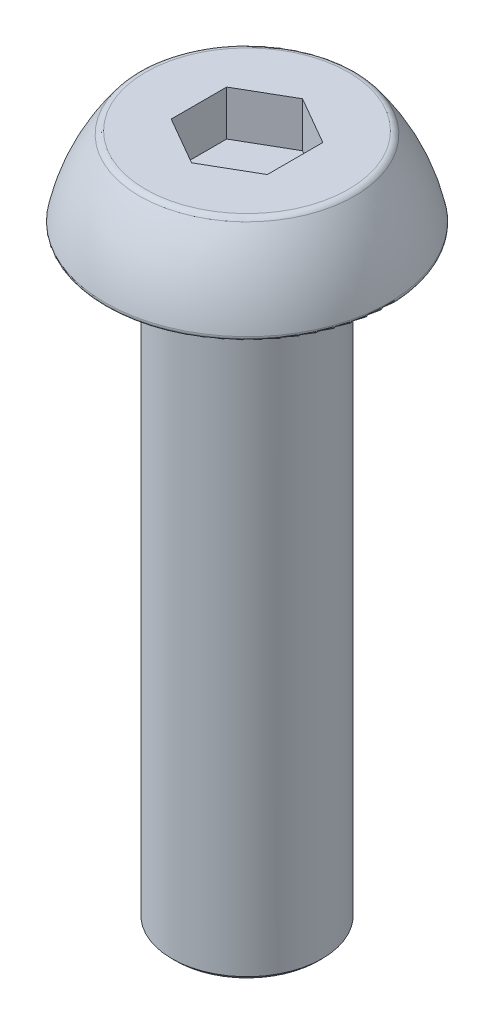
ISO-10303-21;
HEADER;
FILE_DESCRIPTION(('STEP AP214'),'2;1');
FILE_NAME('part.step','',(''),(''),'','','');
FILE_SCHEMA(('AUTOMOTIVE_DESIGN { 1 0 10303 214 1 1 1 1 }'));
ENDSEC;
DATA;
#1=APPLICATION_CONTEXT('core data for automotive mechanical design processes');
#2=APPLICATION_PROTOCOL_DEFINITION('international standard','automotive_design',2000,#1);
#3=PRODUCT_CONTEXT('',#1,'mechanical');
#4=PRODUCT('Part','Part','',(#3));
#5=PRODUCT_RELATED_PRODUCT_CATEGORY('part','',(#4));
#6=PRODUCT_DEFINITION_FORMATION('','',#4);
#7=PRODUCT_DEFINITION_CONTEXT('part definition',#1,'design');
#8=PRODUCT_DEFINITION('design','',#6,#7);
#9=PRODUCT_DEFINITION_SHAPE('','',#8);
#10=(LENGTH_UNIT() NAMED_UNIT(*) SI_UNIT(.MILLI.,.METRE.));
#11=(NAMED_UNIT(*) PLANE_ANGLE_UNIT() SI_UNIT($,.RADIAN.));
#12=(NAMED_UNIT(*) SI_UNIT($,.STERADIAN.) SOLID_ANGLE_UNIT());
#13=UNCERTAINTY_MEASURE_WITH_UNIT(LENGTH_MEASURE(1.E-05),#10,'distance_accuracy_value','');
#14=(GEOMETRIC_REPRESENTATION_CONTEXT(3) GLOBAL_UNCERTAINTY_ASSIGNED_CONTEXT((#13)) GLOBAL_UNIT_ASSIGNED_CONTEXT((#10,
#11,#12)) REPRESENTATION_CONTEXT('',''));
#15=CARTESIAN_POINT('',(0.,0.,0.));
#16=DIRECTION('',(0.,0.,1.));
#17=DIRECTION('',(1.,0.,0.));
#18=AXIS2_PLACEMENT_3D('',#15,#16,#17);
#19=CARTESIAN_POINT('',(0.,0.,0.));
#20=DIRECTION('',(0.,1.,0.));
#21=DIRECTION('',(0.,0.,1.));
#22=AXIS2_PLACEMENT_3D('',#19,#20,#21);
#23=PLANE('',#22);
#24=CARTESIAN_POINT('',(0.,0.,0.));
#25=DIRECTION('',(0.,1.,0.));
#26=DIRECTION('',(0.,0.,1.));
#27=AXIS2_PLACEMENT_3D('',#24,#25,#26);
#28=CIRCLE('',#27,3.67834475098621);
#29=CARTESIAN_POINT('',(0.,0.,3.67834475098621));
#30=VERTEX_POINT('',#29);
#31=EDGE_CURVE('E118',#30,#30,#28,.F.);
#32=ORIENTED_EDGE('',*,*,#31,.T.);
#33=EDGE_LOOP('',(#32));
#34=FACE_BOUND('',#33,.T.);
#35=CARTESIAN_POINT('',(0.,0.,0.));
#36=DIRECTION('',(0.,1.,0.));
#37=DIRECTION('',(0.,0.,1.));
#38=AXIS2_PLACEMENT_3D('',#35,#36,#37);
#39=CIRCLE('',#38,2.);
#40=CARTESIAN_POINT('',(0.,0.,2.));
#41=VERTEX_POINT('',#40);
#42=EDGE_CURVE('E137',#41,#41,#39,.F.);
#43=ORIENTED_EDGE('',*,*,#42,.F.);
#44=EDGE_LOOP('',(#43));
#45=FACE_BOUND('',#44,.T.);
#46=ADVANCED_FACE('F17',(#34,#45),#23,.F.);
#47=CARTESIAN_POINT('',(-2.8,2.2,0.));
#48=DIRECTION('',(0.,-1.,0.));
#49=DIRECTION('',(0.,0.,-1.));
#50=AXIS2_PLACEMENT_3D('',#47,#48,#49);
#51=PLANE('',#50);
#52=DIRECTION('',(-0.866025403784441,0.,0.5));
#53=VECTOR('',#52,1.);
#54=CARTESIAN_POINT('',(0.,2.2,-1.47801668912542));
#55=LINE('',#54,#53);
#56=CARTESIAN_POINT('',(0.,2.2,-1.47801668912542));
#57=VERTEX_POINT('',#56);
#58=CARTESIAN_POINT('',(-1.27999999999998,2.2,-0.739008344562711));
#59=VERTEX_POINT('',#58);
#60=EDGE_CURVE('E106',#57,#59,#55,.T.);
#61=ORIENTED_EDGE('',*,*,#60,.F.);
#62=DIRECTION('',(-0.866025403784441,0.,-0.5));
#63=VECTOR('',#62,1.);
#64=CARTESIAN_POINT('',(1.28,2.2,-0.739008344562722));
#65=LINE('',#64,#63);
#66=CARTESIAN_POINT('',(1.28,2.2,-0.739008344562722));
#67=VERTEX_POINT('',#66);
#68=EDGE_CURVE('E32',#67,#57,#65,.T.);
#69=ORIENTED_EDGE('',*,*,#68,.F.);
#70=DIRECTION('',(0.,0.,-1.));
#71=VECTOR('',#70,1.);
#72=CARTESIAN_POINT('',(1.28,2.2,0.739008344562721));
#73=LINE('',#72,#71);
#74=CARTESIAN_POINT('',(1.28,2.2,0.739008344562721));
#75=VERTEX_POINT('',#74);
#76=EDGE_CURVE('E113',#75,#67,#73,.T.);
#77=ORIENTED_EDGE('',*,*,#76,.F.);
#78=DIRECTION('',(0.866025403784439,0.,-0.5));
#79=VECTOR('',#78,1.);
#80=CARTESIAN_POINT('',(0.,2.2,1.47801668912544));
#81=LINE('',#80,#79);
#82=CARTESIAN_POINT('',(0.,2.2,1.47801668912544));
#83=VERTEX_POINT('',#82);
#84=EDGE_CURVE('E114',#83,#75,#81,.T.);
#85=ORIENTED_EDGE('',*,*,#84,.F.);
#86=DIRECTION('',(0.866025403784439,0.,0.5));
#87=VECTOR('',#86,1.);
#88=CARTESIAN_POINT('',(-1.28,2.2,0.739008344562721));
#89=LINE('',#88,#87);
#90=CARTESIAN_POINT('',(-1.28,2.2,0.739008344562721));
#91=VERTEX_POINT('',#90);
#92=EDGE_CURVE('E79',#91,#83,#89,.T.);
#93=ORIENTED_EDGE('',*,*,#92,.F.);
#94=DIRECTION('',(0.,0.,1.));
#95=VECTOR('',#94,1.);
#96=CARTESIAN_POINT('',(-1.27999999999998,2.2,-0.739008344562711));
#97=LINE('',#96,#95);
#98=EDGE_CURVE('E108',#59,#91,#97,.T.);
#99=ORIENTED_EDGE('',*,*,#98,.F.);
#100=EDGE_LOOP('',(#61,#69,#77,#85,#93,#99));
#101=FACE_BOUND('',#100,.T.);
#102=CARTESIAN_POINT('',(0.,2.2,0.));
#103=DIRECTION('',(0.,-1.,0.));
#104=DIRECTION('',(0.,0.,-1.));
#105=AXIS2_PLACEMENT_3D('',#102,#103,#104);
#106=CIRCLE('',#105,2.70215560417085);
#107=CARTESIAN_POINT('',(0.,2.2,-2.70215560417085));
#108=VERTEX_POINT('',#107);
#109=EDGE_CURVE('E132',#108,#108,#106,.F.);
#110=ORIENTED_EDGE('',*,*,#109,.T.);
#111=EDGE_LOOP('',(#110));
#112=FACE_BOUND('',#111,.T.);
#113=ADVANCED_FACE('F152',(#101,#112),#51,.F.);
#114=CARTESIAN_POINT('',(0.,-0.90769069276326,0.));
#115=DIRECTION('',(0.,-1.,0.));
#116=DIRECTION('',(0.,0.,-1.));
#117=AXIS2_PLACEMENT_3D('',#114,#115,#116);
#118=DEGENERATE_TOROIDAL_SURFACE('',#117,1.11691952407917,5.,.F.);
#119=CARTESIAN_POINT('',(0.,2.12115377886514,0.));
#120=DIRECTION('',(0.,-1.,0.));
#121=DIRECTION('',(0.,0.,-1.));
#122=AXIS2_PLACEMENT_3D('',#119,#120,#121);
#123=CIRCLE('',#122,2.8612837345146);
#124=CARTESIAN_POINT('',(0.,2.12115377886514,-2.8612837345146));
#125=VERTEX_POINT('',#124);
#126=EDGE_CURVE('E129',#125,#125,#123,.T.);
#127=ORIENTED_EDGE('',*,*,#126,.T.);
#128=EDGE_LOOP('',(#127));
#129=FACE_BOUND('',#128,.T.);
#130=CARTESIAN_POINT('',(0.,0.120565116178842,0.));
#131=DIRECTION('',(0.,-1.,0.));
#132=DIRECTION('',(0.,0.,-1.));
#133=AXIS2_PLACEMENT_3D('',#130,#131,#132);
#134=CIRCLE('',#133,3.77620728721203);
#135=CARTESIAN_POINT('',(0.,0.120565116178842,-3.77620728721203));
#136=VERTEX_POINT('',#135);
#137=EDGE_CURVE('E126',#136,#136,#134,.F.);
#138=ORIENTED_EDGE('',*,*,#137,.T.);
#139=EDGE_LOOP('',(#138));
#140=FACE_BOUND('',#139,.T.);
#141=ADVANCED_FACE('F161',(#129,#140),#118,.F.);
#142=CARTESIAN_POINT('',(0.,0.1,0.));
#143=DIRECTION('',(0.,1.,0.));
#144=DIRECTION('',(0.,0.,1.));
#145=AXIS2_PLACEMENT_3D('',#142,#143,#144);
#146=TOROIDAL_SURFACE('',#145,3.67834475098621,0.1);
#147=ORIENTED_EDGE('',*,*,#137,.F.);
#148=EDGE_LOOP('',(#147));
#149=FACE_BOUND('',#148,.T.);
#150=ORIENTED_EDGE('',*,*,#31,.F.);
#151=EDGE_LOOP('',(#150));
#152=FACE_BOUND('',#151,.T.);
#153=ADVANCED_FACE('F168',(#149,#152),#146,.T.);
#154=CARTESIAN_POINT('',(0.,2.,0.));
#155=DIRECTION('',(0.,-1.,0.));
#156=DIRECTION('',(0.,0.,-1.));
#157=AXIS2_PLACEMENT_3D('',#154,#155,#156);
#158=TOROIDAL_SURFACE('',#157,2.70215560417085,0.2);
#159=ORIENTED_EDGE('',*,*,#109,.F.);
#160=EDGE_LOOP('',(#159));
#161=FACE_BOUND('',#160,.T.);
#162=ORIENTED_EDGE('',*,*,#126,.F.);
#163=EDGE_LOOP('',(#162));
#164=FACE_BOUND('',#163,.T.);
#165=ADVANCED_FACE('F173',(#161,#164),#158,.T.);
#166=CARTESIAN_POINT('',(1.28,1.,-0.739008344562722));
#167=DIRECTION('',(0.5,0.,-0.866025403784441));
#168=DIRECTION('',(-0.866025403784441,0.,-0.5));
#169=AXIS2_PLACEMENT_3D('',#166,#167,#168);
#170=PLANE('',#169);
#171=ORIENTED_EDGE('',*,*,#68,.T.);
#172=DIRECTION('',(0.,1.,0.));
#173=VECTOR('',#172,1.);
#174=CARTESIAN_POINT('',(0.,1.,-1.47801668912542));
#175=LINE('',#174,#173);
#176=CARTESIAN_POINT('',(0.,1.,-1.47801668912542));
#177=VERTEX_POINT('',#176);
#178=EDGE_CURVE('E62',#177,#57,#175,.T.);
#179=ORIENTED_EDGE('',*,*,#178,.F.);
#180=DIRECTION('',(-0.866025403784441,0.,-0.5));
#181=VECTOR('',#180,1.);
#182=CARTESIAN_POINT('',(1.28,1.,-0.739008344562722));
#183=LINE('',#182,#181);
#184=CARTESIAN_POINT('',(1.28,1.,-0.739008344562722));
#185=VERTEX_POINT('',#184);
#186=EDGE_CURVE('E117',#185,#177,#183,.T.);
#187=ORIENTED_EDGE('',*,*,#186,.F.);
#188=DIRECTION('',(0.,1.,0.));
#189=VECTOR('',#188,1.);
#190=CARTESIAN_POINT('',(1.28,1.,-0.739008344562722));
#191=LINE('',#190,#189);
#192=EDGE_CURVE('E37',#185,#67,#191,.T.);
#193=ORIENTED_EDGE('',*,*,#192,.T.);
#194=EDGE_LOOP('',(#171,#179,#187,#193));
#195=FACE_BOUND('',#194,.T.);
#196=ADVANCED_FACE('F170',(#195),#170,.F.);
#197=CARTESIAN_POINT('',(1.28,1.,0.739008344562721));
#198=DIRECTION('',(1.,0.,0.));
#199=DIRECTION('',(0.,0.,-1.));
#200=AXIS2_PLACEMENT_3D('',#197,#198,#199);
#201=PLANE('',#200);
#202=ORIENTED_EDGE('',*,*,#76,.T.);
#203=ORIENTED_EDGE('',*,*,#192,.F.);
#204=DIRECTION('',(0.,0.,-1.));
#205=VECTOR('',#204,1.);
#206=CARTESIAN_POINT('',(1.28,1.,0.739008344562721));
#207=LINE('',#206,#205);
#208=CARTESIAN_POINT('',(1.28,1.,0.739008344562721));
#209=VERTEX_POINT('',#208);
#210=EDGE_CURVE('E95',#209,#185,#207,.T.);
#211=ORIENTED_EDGE('',*,*,#210,.F.);
#212=DIRECTION('',(0.,1.,0.));
#213=VECTOR('',#212,1.);
#214=CARTESIAN_POINT('',(1.28,1.,0.739008344562721));
#215=LINE('',#214,#213);
#216=EDGE_CURVE('E81',#209,#75,#215,.T.);
#217=ORIENTED_EDGE('',*,*,#216,.T.);
#218=EDGE_LOOP('',(#202,#203,#211,#217));
#219=FACE_BOUND('',#218,.T.);
#220=ADVANCED_FACE('F181',(#219),#201,.F.);
#221=CARTESIAN_POINT('',(0.,1.,1.47801668912544));
#222=DIRECTION('',(0.5,0.,0.866025403784439));
#223=DIRECTION('',(0.866025403784439,0.,-0.5));
#224=AXIS2_PLACEMENT_3D('',#221,#222,#223);
#225=PLANE('',#224);
#226=ORIENTED_EDGE('',*,*,#84,.T.);
#227=ORIENTED_EDGE('',*,*,#216,.F.);
#228=DIRECTION('',(0.866025403784439,0.,-0.5));
#229=VECTOR('',#228,1.);
#230=CARTESIAN_POINT('',(0.,1.,1.47801668912544));
#231=LINE('',#230,#229);
#232=CARTESIAN_POINT('',(0.,1.,1.47801668912544));
#233=VERTEX_POINT('',#232);
#234=EDGE_CURVE('E86',#233,#209,#231,.T.);
#235=ORIENTED_EDGE('',*,*,#234,.F.);
#236=DIRECTION('',(0.,1.,0.));
#237=VECTOR('',#236,1.);
#238=CARTESIAN_POINT('',(0.,1.,1.47801668912544));
#239=LINE('',#238,#237);
#240=EDGE_CURVE('E73',#233,#83,#239,.T.);
#241=ORIENTED_EDGE('',*,*,#240,.T.);
#242=EDGE_LOOP('',(#226,#227,#235,#241));
#243=FACE_BOUND('',#242,.T.);
#244=ADVANCED_FACE('F90',(#243),#225,.F.);
#245=CARTESIAN_POINT('',(-1.28,1.,0.739008344562721));
#246=DIRECTION('',(-0.5,0.,0.866025403784439));
#247=DIRECTION('',(0.866025403784439,0.,0.5));
#248=AXIS2_PLACEMENT_3D('',#245,#246,#247);
#249=PLANE('',#248);
#250=ORIENTED_EDGE('',*,*,#92,.T.);
#251=ORIENTED_EDGE('',*,*,#240,.F.);
#252=DIRECTION('',(0.866025403784439,0.,0.5));
#253=VECTOR('',#252,1.);
#254=CARTESIAN_POINT('',(-1.28,1.,0.739008344562721));
#255=LINE('',#254,#253);
#256=CARTESIAN_POINT('',(-1.28,1.,0.739008344562721));
#257=VERTEX_POINT('',#256);
#258=EDGE_CURVE('E80',#257,#233,#255,.T.);
#259=ORIENTED_EDGE('',*,*,#258,.F.);
#260=DIRECTION('',(0.,1.,0.));
#261=VECTOR('',#260,1.);
#262=CARTESIAN_POINT('',(-1.28,1.,0.739008344562721));
#263=LINE('',#262,#261);
#264=EDGE_CURVE('E83',#257,#91,#263,.T.);
#265=ORIENTED_EDGE('',*,*,#264,.T.);
#266=EDGE_LOOP('',(#250,#251,#259,#265));
#267=FACE_BOUND('',#266,.T.);
#268=ADVANCED_FACE('F74',(#267),#249,.F.);
#269=CARTESIAN_POINT('',(-1.27999999999998,1.,-0.739008344562711));
#270=DIRECTION('',(-1.,0.,0.));
#271=DIRECTION('',(0.,0.,1.));
#272=AXIS2_PLACEMENT_3D('',#269,#270,#271);
#273=PLANE('',#272);
#274=ORIENTED_EDGE('',*,*,#98,.T.);
#275=ORIENTED_EDGE('',*,*,#264,.F.);
#276=DIRECTION('',(0.,0.,1.));
#277=VECTOR('',#276,1.);
#278=CARTESIAN_POINT('',(-1.27999999999998,1.,-0.739008344562711));
#279=LINE('',#278,#277);
#280=CARTESIAN_POINT('',(-1.27999999999998,1.,-0.739008344562711));
#281=VERTEX_POINT('',#280);
#282=EDGE_CURVE('E98',#281,#257,#279,.T.);
#283=ORIENTED_EDGE('',*,*,#282,.F.);
#284=DIRECTION('',(0.,1.,0.));
#285=VECTOR('',#284,1.);
#286=CARTESIAN_POINT('',(-1.27999999999998,1.,-0.739008344562711));
#287=LINE('',#286,#285);
#288=EDGE_CURVE('E121',#281,#59,#287,.T.);
#289=ORIENTED_EDGE('',*,*,#288,.T.);
#290=EDGE_LOOP('',(#274,#275,#283,#289));
#291=FACE_BOUND('',#290,.T.);
#292=ADVANCED_FACE('F206',(#291),#273,.F.);
#293=CARTESIAN_POINT('',(0.,1.,-1.47801668912542));
#294=DIRECTION('',(-0.5,0.,-0.866025403784441));
#295=DIRECTION('',(-0.866025403784441,0.,0.5));
#296=AXIS2_PLACEMENT_3D('',#293,#294,#295);
#297=PLANE('',#296);
#298=ORIENTED_EDGE('',*,*,#60,.T.);
#299=ORIENTED_EDGE('',*,*,#288,.F.);
#300=DIRECTION('',(-0.866025403784441,0.,0.5));
#301=VECTOR('',#300,1.);
#302=CARTESIAN_POINT('',(0.,1.,-1.47801668912542));
#303=LINE('',#302,#301);
#304=EDGE_CURVE('E99',#177,#281,#303,.T.);
#305=ORIENTED_EDGE('',*,*,#304,.F.);
#306=ORIENTED_EDGE('',*,*,#178,.T.);
#307=EDGE_LOOP('',(#298,#299,#305,#306));
#308=FACE_BOUND('',#307,.T.);
#309=ADVANCED_FACE('F208',(#308),#297,.F.);
#310=CARTESIAN_POINT('',(0.,1.,0.));
#311=DIRECTION('',(0.,1.,0.));
#312=DIRECTION('',(0.,0.,1.));
#313=AXIS2_PLACEMENT_3D('',#310,#311,#312);
#314=PLANE('',#313);
#315=ORIENTED_EDGE('',*,*,#186,.T.);
#316=ORIENTED_EDGE('',*,*,#304,.T.);
#317=ORIENTED_EDGE('',*,*,#282,.T.);
#318=ORIENTED_EDGE('',*,*,#258,.T.);
#319=ORIENTED_EDGE('',*,*,#234,.T.);
#320=ORIENTED_EDGE('',*,*,#210,.T.);
#321=EDGE_LOOP('',(#315,#316,#317,#318,#319,#320));
#322=FACE_BOUND('',#321,.T.);
#323=ADVANCED_FACE('F92',(#322),#314,.T.);
#324=CARTESIAN_POINT('',(0.,-16.,0.));
#325=DIRECTION('',(0.,1.,0.));
#326=DIRECTION('',(0.,0.,1.));
#327=AXIS2_PLACEMENT_3D('',#324,#325,#326);
#328=CYLINDRICAL_SURFACE('',#327,2.);
#329=CARTESIAN_POINT('',(0.,-15.9,0.));
#330=DIRECTION('',(0.,-1.,0.));
#331=DIRECTION('',(0.,0.,-1.));
#332=AXIS2_PLACEMENT_3D('',#329,#330,#331);
#333=CIRCLE('',#332,2.);
#334=CARTESIAN_POINT('',(0.,-15.9,-2.));
#335=VERTEX_POINT('',#334);
#336=EDGE_CURVE('E11',#335,#335,#333,.F.);
#337=ORIENTED_EDGE('',*,*,#336,.T.);
#338=EDGE_LOOP('',(#337));
#339=FACE_BOUND('',#338,.T.);
#340=ORIENTED_EDGE('',*,*,#42,.T.);
#341=EDGE_LOOP('',(#340));
#342=FACE_BOUND('',#341,.T.);
#343=ADVANCED_FACE('F147',(#339,#342),#328,.T.);
#344=CARTESIAN_POINT('',(0.,-16.,0.));
#345=DIRECTION('',(0.,-1.,0.));
#346=DIRECTION('',(0.,0.,-1.));
#347=AXIS2_PLACEMENT_3D('',#344,#345,#346);
#348=PLANE('',#347);
#349=CARTESIAN_POINT('',(0.,-16.,0.));
#350=DIRECTION('',(0.,-1.,0.));
#351=DIRECTION('',(0.,0.,-1.));
#352=AXIS2_PLACEMENT_3D('',#349,#350,#351);
#353=CIRCLE('',#352,1.9);
#354=CARTESIAN_POINT('',(0.,-16.,-1.9));
#355=VERTEX_POINT('',#354);
#356=EDGE_CURVE('E25',#355,#355,#353,.T.);
#357=ORIENTED_EDGE('',*,*,#356,.T.);
#358=EDGE_LOOP('',(#357));
#359=FACE_BOUND('',#358,.T.);
#360=ADVANCED_FACE('F143',(#359),#348,.T.);
#361=CARTESIAN_POINT('',(0.,-16.,0.));
#362=DIRECTION('',(0.,1.,0.));
#363=DIRECTION('',(0.,0.,1.));
#364=AXIS2_PLACEMENT_3D('',#361,#362,#363);
#365=CONICAL_SURFACE('',#364,1.9,0.785398163397439);
#366=ORIENTED_EDGE('',*,*,#336,.F.);
#367=EDGE_LOOP('',(#366));
#368=FACE_BOUND('',#367,.T.);
#369=ORIENTED_EDGE('',*,*,#356,.F.);
#370=EDGE_LOOP('',(#369));
#371=FACE_BOUND('',#370,.T.);
#372=ADVANCED_FACE('F19',(#368,#371),#365,.T.);
#373=CLOSED_SHELL('',(#46,#113,#141,#153,#165,#196,#220,#244,#268,#292,#309,#323,#343,#360,#372));
#374=MANIFOLD_SOLID_BREP('B1',#373);
#375=ADVANCED_BREP_SHAPE_REPRESENTATION('',(#18,#374),#14);
#376=SHAPE_DEFINITION_REPRESENTATION(#9,#375);
ENDSEC;
END-ISO-10303-21;
